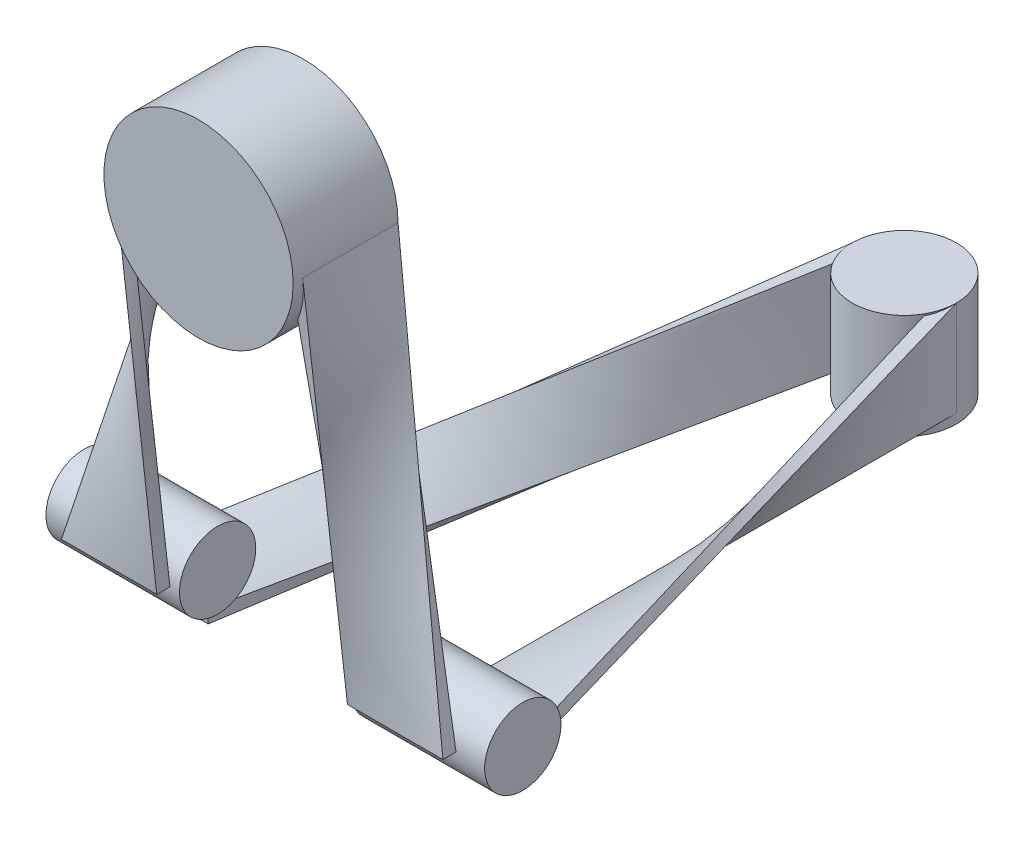
ISO-10303-21;
HEADER;
FILE_DESCRIPTION(('STEP AP214'),'2;1');
FILE_NAME('part.step','',(''),(''),'','','');
FILE_SCHEMA(('AUTOMOTIVE_DESIGN { 1 0 10303 214 1 1 1 1 }'));
ENDSEC;
DATA;
#1=APPLICATION_CONTEXT('core data for automotive mechanical design processes');
#2=APPLICATION_PROTOCOL_DEFINITION('international standard','automotive_design',2000,#1);
#3=PRODUCT_CONTEXT('',#1,'mechanical');
#4=PRODUCT('Part','Part','',(#3));
#5=PRODUCT_RELATED_PRODUCT_CATEGORY('part','',(#4));
#6=PRODUCT_DEFINITION_FORMATION('','',#4);
#7=PRODUCT_DEFINITION_CONTEXT('part definition',#1,'design');
#8=PRODUCT_DEFINITION('design','',#6,#7);
#9=PRODUCT_DEFINITION_SHAPE('','',#8);
#10=(LENGTH_UNIT() NAMED_UNIT(*) SI_UNIT(.MILLI.,.METRE.));
#11=(NAMED_UNIT(*) PLANE_ANGLE_UNIT() SI_UNIT($,.RADIAN.));
#12=(NAMED_UNIT(*) SI_UNIT($,.STERADIAN.) SOLID_ANGLE_UNIT());
#13=UNCERTAINTY_MEASURE_WITH_UNIT(LENGTH_MEASURE(1.E-05),#10,'distance_accuracy_value','');
#14=(GEOMETRIC_REPRESENTATION_CONTEXT(3) GLOBAL_UNCERTAINTY_ASSIGNED_CONTEXT((#13)) GLOBAL_UNIT_ASSIGNED_CONTEXT((#10,
#11,#12)) REPRESENTATION_CONTEXT('',''));
#15=CARTESIAN_POINT('',(0.,0.,0.));
#16=DIRECTION('',(0.,0.,1.));
#17=DIRECTION('',(1.,0.,0.));
#18=AXIS2_PLACEMENT_3D('',#15,#16,#17);
#19=CARTESIAN_POINT('',(0.,-41.,0.));
#20=DIRECTION('',(0.,-1.,0.));
#21=DIRECTION('',(0.,0.,-1.));
#22=AXIS2_PLACEMENT_3D('',#19,#20,#21);
#23=PLANE('',#22);
#24=DIRECTION('',(0.,0.,-1.));
#25=VECTOR('',#24,1.);
#26=CARTESIAN_POINT('',(-20.,-41.,5.38));
#27=LINE('',#26,#25);
#28=CARTESIAN_POINT('',(-20.,-41.,5.38));
#29=VERTEX_POINT('',#28);
#30=CARTESIAN_POINT('',(-20.,-41.,4.));
#31=VERTEX_POINT('',#30);
#32=EDGE_CURVE('E256',#29,#31,#27,.T.);
#33=ORIENTED_EDGE('',*,*,#32,.T.);
#34=DIRECTION('',(-1.,0.,0.));
#35=VECTOR('',#34,1.);
#36=CARTESIAN_POINT('',(-9.99999999999999,-41.,4.));
#37=LINE('',#36,#35);
#38=CARTESIAN_POINT('',(-9.99999999999999,-41.,4.));
#39=VERTEX_POINT('',#38);
#40=EDGE_CURVE('E247',#39,#31,#37,.T.);
#41=ORIENTED_EDGE('',*,*,#40,.F.);
#42=DIRECTION('',(0.,0.,1.));
#43=VECTOR('',#42,1.);
#44=CARTESIAN_POINT('',(-9.99999999999999,-41.,4.));
#45=LINE('',#44,#43);
#46=CARTESIAN_POINT('',(-9.99999999999999,-41.,5.38));
#47=VERTEX_POINT('',#46);
#48=EDGE_CURVE('E74',#39,#47,#45,.T.);
#49=ORIENTED_EDGE('',*,*,#48,.T.);
#50=DIRECTION('',(-1.,0.,0.));
#51=VECTOR('',#50,1.);
#52=CARTESIAN_POINT('',(-9.99999999999999,-41.,5.38));
#53=LINE('',#52,#51);
#54=EDGE_CURVE('E13',#47,#29,#53,.T.);
#55=ORIENTED_EDGE('',*,*,#54,.T.);
#56=EDGE_LOOP('',(#33,#41,#49,#55));
#57=FACE_BOUND('',#56,.T.);
#58=ADVANCED_FACE('F64',(#57),#23,.T.);
#59=CARTESIAN_POINT('',(0.,0.,0.));
#60=DIRECTION('',(0.,1.,0.));
#61=DIRECTION('',(0.,0.,1.));
#62=AXIS2_PLACEMENT_3D('',#59,#60,#61);
#63=PLANE('',#62);
#64=DIRECTION('',(-1.,0.,0.));
#65=VECTOR('',#64,1.);
#66=CARTESIAN_POINT('',(-8.539796,0.,0.));
#67=LINE('',#66,#65);
#68=CARTESIAN_POINT('',(-8.539796,0.,0.));
#69=VERTEX_POINT('',#68);
#70=CARTESIAN_POINT('',(-9.919796,0.,0.));
#71=VERTEX_POINT('',#70);
#72=EDGE_CURVE('E133',#69,#71,#67,.T.);
#73=ORIENTED_EDGE('',*,*,#72,.T.);
#74=DIRECTION('',(0.,0.,-1.));
#75=VECTOR('',#74,1.);
#76=CARTESIAN_POINT('',(-9.919796,0.,10.));
#77=LINE('',#76,#75);
#78=CARTESIAN_POINT('',(-9.919796,0.,10.));
#79=VERTEX_POINT('',#78);
#80=EDGE_CURVE('E113',#79,#71,#77,.T.);
#81=ORIENTED_EDGE('',*,*,#80,.F.);
#82=DIRECTION('',(1.,0.,0.));
#83=VECTOR('',#82,1.);
#84=CARTESIAN_POINT('',(-9.919796,0.,10.));
#85=LINE('',#84,#83);
#86=CARTESIAN_POINT('',(-8.539796,0.,10.));
#87=VERTEX_POINT('',#86);
#88=EDGE_CURVE('E122',#79,#87,#85,.T.);
#89=ORIENTED_EDGE('',*,*,#88,.T.);
#90=DIRECTION('',(0.,0.,-1.));
#91=VECTOR('',#90,1.);
#92=CARTESIAN_POINT('',(-8.539796,0.,10.));
#93=LINE('',#92,#91);
#94=EDGE_CURVE('E119',#87,#69,#93,.T.);
#95=ORIENTED_EDGE('',*,*,#94,.T.);
#96=EDGE_LOOP('',(#73,#81,#89,#95));
#97=FACE_BOUND('',#96,.T.);
#98=ADVANCED_FACE('F132',(#97),#63,.T.);
#99=CARTESIAN_POINT('',(-9.919796,0.,10.));
#100=CARTESIAN_POINT('',(-9.99999999999999,-41.,5.38));
#101=CARTESIAN_POINT('',(-9.689796,0.,10.));
#102=CARTESIAN_POINT('',(-9.99999999999999,-41.,5.15));
#103=CARTESIAN_POINT('',(-9.459796,0.,10.));
#104=CARTESIAN_POINT('',(-9.99999999999999,-41.,4.92));
#105=CARTESIAN_POINT('',(-8.999796,0.,10.));
#106=CARTESIAN_POINT('',(-9.99999999999999,-41.,4.46));
#107=CARTESIAN_POINT('',(-8.769796,0.,10.));
#108=CARTESIAN_POINT('',(-9.99999999999999,-41.,4.23));
#109=CARTESIAN_POINT('',(-8.539796,0.,10.));
#110=CARTESIAN_POINT('',(-9.99999999999999,-41.,4.));
#111=B_SPLINE_SURFACE_WITH_KNOTS('',3,1,((#99,#100),(#101,#102),(#103,#104),(#105,#106),(#107,
#108),(#109,#110)),.UNSPECIFIED.,.F.,.F.,.F.,(4,2,4),(2,2),(0.,0.5,1.),(0.,1.),.UNSPECIFIED.);
#112=DIRECTION('',(0.00194388914486237,0.993709228210088,0.111974064251966));
#113=VECTOR('',#112,1.);
#114=CARTESIAN_POINT('',(-9.959898,-20.5,7.69));
#115=LINE('',#114,#113);
#116=EDGE_CURVE('E109',#47,#79,#115,.T.);
#117=DIRECTION('',(-0.0352175302961988,-0.988847272123728,-0.144709356896155));
#118=VECTOR('',#117,1.);
#119=CARTESIAN_POINT('',(-9.269898,-20.5,7.));
#120=LINE('',#119,#118);
#121=EDGE_CURVE('E89',#87,#39,#120,.T.);
#122=ORIENTED_EDGE('',*,*,#88,.F.);
#123=ORIENTED_EDGE('',*,*,#116,.F.);
#124=ORIENTED_EDGE('',*,*,#48,.F.);
#125=ORIENTED_EDGE('',*,*,#121,.F.);
#126=EDGE_LOOP('',(#122,#123,#124,#125));
#127=FACE_BOUND('',#126,.T.);
#128=ADVANCED_FACE('F124',(#127),#111,.F.);
#129=CARTESIAN_POINT('',(-8.539796,0.,10.));
#130=CARTESIAN_POINT('',(-9.99999999999999,-41.,4.));
#131=CARTESIAN_POINT('',(-8.539796,0.,8.33333333333334));
#132=CARTESIAN_POINT('',(-11.6666666666667,-41.,4.));
#133=CARTESIAN_POINT('',(-8.539796,0.,6.66666666666667));
#134=CARTESIAN_POINT('',(-13.3333333333333,-41.,4.));
#135=CARTESIAN_POINT('',(-8.539796,0.,3.33333333333334));
#136=CARTESIAN_POINT('',(-16.6666666666667,-41.,4.));
#137=CARTESIAN_POINT('',(-8.539796,0.,1.66666666666667));
#138=CARTESIAN_POINT('',(-18.3333333333333,-41.,4.));
#139=CARTESIAN_POINT('',(-8.539796,0.,0.));
#140=CARTESIAN_POINT('',(-20.,-41.,4.));
#141=B_SPLINE_SURFACE_WITH_KNOTS('',3,1,((#129,#130),(#131,#132),(#133,#134),(#135,#136),(#137,
#138),(#139,#140)),.UNSPECIFIED.,.F.,.F.,.F.,(4,2,4),(2,2),(0.,0.5,1.),(0.,1.),.UNSPECIFIED.);
#142=DIRECTION('',(-0.26801821496093,-0.958861361752211,0.0935474499270449));
#143=VECTOR('',#142,1.);
#144=CARTESIAN_POINT('',(-14.269898,-20.5,2.));
#145=LINE('',#144,#143);
#146=EDGE_CURVE('E82',#69,#31,#145,.T.);
#147=ORIENTED_EDGE('',*,*,#94,.F.);
#148=ORIENTED_EDGE('',*,*,#121,.T.);
#149=ORIENTED_EDGE('',*,*,#40,.T.);
#150=ORIENTED_EDGE('',*,*,#146,.F.);
#151=EDGE_LOOP('',(#147,#148,#149,#150));
#152=FACE_BOUND('',#151,.T.);
#153=ADVANCED_FACE('F214',(#152),#141,.F.);
#154=CARTESIAN_POINT('',(-9.919796,0.,0.));
#155=CARTESIAN_POINT('',(-20.,-41.,5.38));
#156=CARTESIAN_POINT('',(-9.919796,0.,1.66666666666666));
#157=CARTESIAN_POINT('',(-18.3333333333333,-41.,5.38));
#158=CARTESIAN_POINT('',(-9.919796,0.,3.33333333333333));
#159=CARTESIAN_POINT('',(-16.6666666666667,-41.,5.38));
#160=CARTESIAN_POINT('',(-9.919796,0.,6.66666666666666));
#161=CARTESIAN_POINT('',(-13.3333333333333,-41.,5.38));
#162=CARTESIAN_POINT('',(-9.919796,0.,8.33333333333333));
#163=CARTESIAN_POINT('',(-11.6666666666667,-41.,5.38));
#164=CARTESIAN_POINT('',(-9.919796,0.,10.));
#165=CARTESIAN_POINT('',(-9.99999999999999,-41.,5.38));
#166=B_SPLINE_SURFACE_WITH_KNOTS('',3,1,((#154,#155),(#156,#157),(#158,#159),(#160,#161),(#162,
#163),(#164,#165)),.UNSPECIFIED.,.F.,.F.,.F.,(4,2,4),(2,2),(0.,0.5,1.),(0.,1.),.UNSPECIFIED.);
#167=DIRECTION('',(-0.236833738086735,-0.963292336301542,0.126402750470788));
#168=VECTOR('',#167,1.);
#169=CARTESIAN_POINT('',(-14.959898,-20.5,2.69));
#170=LINE('',#169,#168);
#171=EDGE_CURVE('E185',#71,#29,#170,.T.);
#172=ORIENTED_EDGE('',*,*,#80,.T.);
#173=ORIENTED_EDGE('',*,*,#171,.T.);
#174=ORIENTED_EDGE('',*,*,#54,.F.);
#175=ORIENTED_EDGE('',*,*,#116,.T.);
#176=EDGE_LOOP('',(#172,#173,#174,#175));
#177=FACE_BOUND('',#176,.T.);
#178=ADVANCED_FACE('F111',(#177),#166,.F.);
#179=CARTESIAN_POINT('',(-8.539796,0.,0.));
#180=CARTESIAN_POINT('',(-20.,-41.,4.));
#181=CARTESIAN_POINT('',(-8.76979600000001,0.,0.));
#182=CARTESIAN_POINT('',(-20.,-41.,4.23));
#183=CARTESIAN_POINT('',(-8.99979600000001,0.,0.));
#184=CARTESIAN_POINT('',(-20.,-41.,4.46));
#185=CARTESIAN_POINT('',(-9.45979600000001,0.,0.));
#186=CARTESIAN_POINT('',(-20.,-41.,4.92));
#187=CARTESIAN_POINT('',(-9.68979600000001,0.,0.));
#188=CARTESIAN_POINT('',(-20.,-41.,5.15));
#189=CARTESIAN_POINT('',(-9.919796,0.,0.));
#190=CARTESIAN_POINT('',(-20.,-41.,5.38));
#191=B_SPLINE_SURFACE_WITH_KNOTS('',3,1,((#179,#180),(#181,#182),(#183,#184),(#185,#186),(#187,
#188),(#189,#190)),.UNSPECIFIED.,.F.,.F.,.F.,(4,2,4),(2,2),(0.,0.5,1.),(0.,1.),.UNSPECIFIED.);
#192=ORIENTED_EDGE('',*,*,#72,.F.);
#193=ORIENTED_EDGE('',*,*,#146,.T.);
#194=ORIENTED_EDGE('',*,*,#32,.F.);
#195=ORIENTED_EDGE('',*,*,#171,.F.);
#196=EDGE_LOOP('',(#192,#193,#194,#195));
#197=FACE_BOUND('',#196,.T.);
#198=ADVANCED_FACE('F184',(#197),#191,.F.);
#199=CLOSED_SHELL('',(#58,#98,#128,#153,#178,#198));
#200=MANIFOLD_SOLID_BREP('B2',#199);
#201=CARTESIAN_POINT('',(0.,0.,-63.));
#202=DIRECTION('',(0.,0.,1.));
#203=DIRECTION('',(-1.,0.,0.));
#204=AXIS2_PLACEMENT_3D('',#201,#202,#203);
#205=PLANE('',#204);
#206=DIRECTION('',(1.,0.,0.));
#207=VECTOR('',#206,1.);
#208=CARTESIAN_POINT('',(-5.46345799999999,-41.,-63.));
#209=LINE('',#208,#207);
#210=CARTESIAN_POINT('',(-5.46345799999999,-41.,-63.));
#211=VERTEX_POINT('',#210);
#212=CARTESIAN_POINT('',(-4.08345799999999,-41.,-63.));
#213=VERTEX_POINT('',#212);
#214=EDGE_CURVE('E459',#211,#213,#209,.T.);
#215=ORIENTED_EDGE('',*,*,#214,.T.);
#216=DIRECTION('',(0.,-1.,0.));
#217=VECTOR('',#216,1.);
#218=CARTESIAN_POINT('',(-4.08345799999999,-41.,-63.));
#219=LINE('',#218,#217);
#220=CARTESIAN_POINT('',(-4.08345799999999,-51.,-63.));
#221=VERTEX_POINT('',#220);
#222=EDGE_CURVE('E616',#213,#221,#219,.T.);
#223=ORIENTED_EDGE('',*,*,#222,.T.);
#224=DIRECTION('',(-1.,0.,0.));
#225=VECTOR('',#224,1.);
#226=CARTESIAN_POINT('',(-4.08345799999999,-51.,-63.));
#227=LINE('',#226,#225);
#228=CARTESIAN_POINT('',(-5.46345799999999,-51.,-63.));
#229=VERTEX_POINT('',#228);
#230=EDGE_CURVE('E420',#221,#229,#227,.T.);
#231=ORIENTED_EDGE('',*,*,#230,.T.);
#232=DIRECTION('',(0.,1.,0.));
#233=VECTOR('',#232,1.);
#234=CARTESIAN_POINT('',(-5.46345799999999,-51.,-63.));
#235=LINE('',#234,#233);
#236=EDGE_CURVE('E62',#229,#211,#235,.T.);
#237=ORIENTED_EDGE('',*,*,#236,.T.);
#238=EDGE_LOOP('',(#215,#223,#231,#237));
#239=FACE_BOUND('',#238,.T.);
#240=ADVANCED_FACE('F410',(#239),#205,.F.);
#241=CARTESIAN_POINT('',(0.,0.,0.));
#242=DIRECTION('',(0.,0.,-1.));
#243=DIRECTION('',(1.,0.,0.));
#244=AXIS2_PLACEMENT_3D('',#241,#242,#243);
#245=PLANE('',#244);
#246=DIRECTION('',(0.,-1.,0.));
#247=VECTOR('',#246,1.);
#248=CARTESIAN_POINT('',(-20.,-45.,0.));
#249=LINE('',#248,#247);
#250=CARTESIAN_POINT('',(-20.,-45.,0.));
#251=VERTEX_POINT('',#250);
#252=CARTESIAN_POINT('',(-20.,-46.38,0.));
#253=VERTEX_POINT('',#252);
#254=EDGE_CURVE('E456',#251,#253,#249,.T.);
#255=ORIENTED_EDGE('',*,*,#254,.T.);
#256=DIRECTION('',(1.,0.,0.));
#257=VECTOR('',#256,1.);
#258=CARTESIAN_POINT('',(-20.,-46.38,0.));
#259=LINE('',#258,#257);
#260=CARTESIAN_POINT('',(-10.,-46.38,0.));
#261=VERTEX_POINT('',#260);
#262=EDGE_CURVE('E464',#253,#261,#259,.T.);
#263=ORIENTED_EDGE('',*,*,#262,.T.);
#264=DIRECTION('',(0.,1.,0.));
#265=VECTOR('',#264,1.);
#266=CARTESIAN_POINT('',(-10.,-46.38,0.));
#267=LINE('',#266,#265);
#268=CARTESIAN_POINT('',(-10.,-45.,0.));
#269=VERTEX_POINT('',#268);
#270=EDGE_CURVE('E470',#261,#269,#267,.T.);
#271=ORIENTED_EDGE('',*,*,#270,.T.);
#272=DIRECTION('',(-1.,0.,0.));
#273=VECTOR('',#272,1.);
#274=CARTESIAN_POINT('',(-10.,-45.,0.));
#275=LINE('',#274,#273);
#276=EDGE_CURVE('E461',#269,#251,#275,.T.);
#277=ORIENTED_EDGE('',*,*,#276,.T.);
#278=EDGE_LOOP('',(#255,#263,#271,#277));
#279=FACE_BOUND('',#278,.T.);
#280=ADVANCED_FACE('F476',(#279),#245,.F.);
#281=CARTESIAN_POINT('',(-20.,-46.38,0.));
#282=CARTESIAN_POINT('',(-5.46345799999999,-41.,-63.));
#283=CARTESIAN_POINT('',(-18.3333333333333,-46.38,0.));
#284=CARTESIAN_POINT('',(-5.46345799999999,-42.6666666666666,-63.));
#285=CARTESIAN_POINT('',(-16.6666666666666,-46.38,0.));
#286=CARTESIAN_POINT('',(-5.46345799999999,-44.3333333333333,-63.));
#287=CARTESIAN_POINT('',(-13.3333333333333,-46.38,0.));
#288=CARTESIAN_POINT('',(-5.46345799999999,-47.6666666666666,-63.));
#289=CARTESIAN_POINT('',(-11.6666666666667,-46.38,0.));
#290=CARTESIAN_POINT('',(-5.46345799999999,-49.3333333333333,-63.));
#291=CARTESIAN_POINT('',(-10.,-46.38,0.));
#292=CARTESIAN_POINT('',(-5.46345799999999,-51.,-63.));
#293=B_SPLINE_SURFACE_WITH_KNOTS('',3,1,((#281,#282),(#283,#284),(#285,#286),(#287,#288),(#289,
#290),(#291,#292)),.UNSPECIFIED.,.F.,.F.,.F.,(4,2,4),(2,2),(0.,0.5,1.),(0.,1.),.UNSPECIFIED.);
#294=DIRECTION('',(-0.224056973740671,-0.0829238837355409,0.971041761215442));
#295=VECTOR('',#294,1.);
#296=CARTESIAN_POINT('',(-12.731729,-43.69,-31.5));
#297=LINE('',#296,#295);
#298=EDGE_CURVE('E428',#211,#253,#297,.T.);
#299=DIRECTION('',(0.0716312758043137,-0.0729490643348894,-0.994759968203039));
#300=VECTOR('',#299,1.);
#301=CARTESIAN_POINT('',(-7.731729,-48.69,-31.5));
#302=LINE('',#301,#300);
#303=EDGE_CURVE('E435',#261,#229,#302,.T.);
#304=ORIENTED_EDGE('',*,*,#262,.F.);
#305=ORIENTED_EDGE('',*,*,#298,.F.);
#306=ORIENTED_EDGE('',*,*,#236,.F.);
#307=ORIENTED_EDGE('',*,*,#303,.F.);
#308=EDGE_LOOP('',(#304,#305,#306,#307));
#309=FACE_BOUND('',#308,.T.);
#310=ADVANCED_FACE('F466',(#309),#293,.F.);
#311=CARTESIAN_POINT('',(-10.,-46.38,0.));
#312=CARTESIAN_POINT('',(-5.46345799999999,-51.,-63.));
#313=CARTESIAN_POINT('',(-10.,-46.15,0.));
#314=CARTESIAN_POINT('',(-5.23345799999997,-51.,-63.));
#315=CARTESIAN_POINT('',(-10.,-45.92,0.));
#316=CARTESIAN_POINT('',(-5.00345799999996,-51.,-63.));
#317=CARTESIAN_POINT('',(-10.,-45.46,0.));
#318=CARTESIAN_POINT('',(-4.54345799999996,-51.,-63.));
#319=CARTESIAN_POINT('',(-10.,-45.23,0.));
#320=CARTESIAN_POINT('',(-4.31345799999997,-51.,-63.));
#321=CARTESIAN_POINT('',(-10.,-45.,0.));
#322=CARTESIAN_POINT('',(-4.08345799999999,-51.,-63.));
#323=B_SPLINE_SURFACE_WITH_KNOTS('',3,1,((#311,#312),(#313,#314),(#315,#316),(#317,#318),(#319,
#320),(#321,#322)),.UNSPECIFIED.,.F.,.F.,.F.,(4,2,4),(2,2),(0.,0.5,1.),(0.,1.),.UNSPECIFIED.);
#324=DIRECTION('',(0.0930844153353303,-0.0943974524328535,-0.991173250544962));
#325=VECTOR('',#324,1.);
#326=CARTESIAN_POINT('',(-7.041729,-48.,-31.5));
#327=LINE('',#326,#325);
#328=EDGE_CURVE('E569',#269,#221,#327,.T.);
#329=ORIENTED_EDGE('',*,*,#270,.F.);
#330=ORIENTED_EDGE('',*,*,#303,.T.);
#331=ORIENTED_EDGE('',*,*,#230,.F.);
#332=ORIENTED_EDGE('',*,*,#328,.F.);
#333=EDGE_LOOP('',(#329,#330,#331,#332));
#334=FACE_BOUND('',#333,.T.);
#335=ADVANCED_FACE('F542',(#334),#323,.F.);
#336=CARTESIAN_POINT('',(-20.,-45.,0.));
#337=CARTESIAN_POINT('',(-4.08345799999999,-41.,-63.));
#338=CARTESIAN_POINT('',(-20.,-45.23,0.));
#339=CARTESIAN_POINT('',(-4.31345799999999,-41.,-63.));
#340=CARTESIAN_POINT('',(-20.,-45.4599999999999,0.));
#341=CARTESIAN_POINT('',(-4.54345799999999,-41.,-63.));
#342=CARTESIAN_POINT('',(-20.,-45.9199999999999,0.));
#343=CARTESIAN_POINT('',(-5.00345799999999,-41.,-63.));
#344=CARTESIAN_POINT('',(-20.,-46.15,0.));
#345=CARTESIAN_POINT('',(-5.23345799999999,-41.,-63.));
#346=CARTESIAN_POINT('',(-20.,-46.38,0.));
#347=CARTESIAN_POINT('',(-5.46345799999999,-41.,-63.));
#348=B_SPLINE_SURFACE_WITH_KNOTS('',3,1,((#336,#337),(#338,#339),(#340,#341),(#342,#343),(#344,
#345),(#346,#347)),.UNSPECIFIED.,.F.,.F.,.F.,(4,2,4),(2,2),(0.,0.5,1.),(0.,1.),.UNSPECIFIED.);
#349=DIRECTION('',(0.244484320759416,0.0614415670839597,-0.967704681572366));
#350=VECTOR('',#349,1.);
#351=CARTESIAN_POINT('',(-12.041729,-43.,-31.5));
#352=LINE('',#351,#350);
#353=EDGE_CURVE('E567',#251,#213,#352,.T.);
#354=ORIENTED_EDGE('',*,*,#254,.F.);
#355=ORIENTED_EDGE('',*,*,#353,.T.);
#356=ORIENTED_EDGE('',*,*,#214,.F.);
#357=ORIENTED_EDGE('',*,*,#298,.T.);
#358=EDGE_LOOP('',(#354,#355,#356,#357));
#359=FACE_BOUND('',#358,.T.);
#360=ADVANCED_FACE('F454',(#359),#348,.F.);
#361=CARTESIAN_POINT('',(-10.,-45.,0.));
#362=CARTESIAN_POINT('',(-4.08345799999999,-51.,-63.));
#363=CARTESIAN_POINT('',(-11.6666666666667,-45.,0.));
#364=CARTESIAN_POINT('',(-4.08345799999999,-49.3333333333333,-63.));
#365=CARTESIAN_POINT('',(-13.3333333333333,-45.,0.));
#366=CARTESIAN_POINT('',(-4.08345799999999,-47.6666666666667,-63.));
#367=CARTESIAN_POINT('',(-16.6666666666667,-45.,0.));
#368=CARTESIAN_POINT('',(-4.08345799999999,-44.3333333333334,-63.));
#369=CARTESIAN_POINT('',(-18.3333333333333,-45.,0.));
#370=CARTESIAN_POINT('',(-4.08345799999999,-42.6666666666667,-63.));
#371=CARTESIAN_POINT('',(-20.,-45.,0.));
#372=CARTESIAN_POINT('',(-4.08345799999999,-41.,-63.));
#373=B_SPLINE_SURFACE_WITH_KNOTS('',3,1,((#361,#362),(#363,#364),(#365,#366),(#367,#368),(#369,
#370),(#371,#372)),.UNSPECIFIED.,.F.,.F.,.F.,(4,2,4),(2,2),(0.,0.5,1.),(0.,1.),.UNSPECIFIED.);
#374=ORIENTED_EDGE('',*,*,#276,.F.);
#375=ORIENTED_EDGE('',*,*,#328,.T.);
#376=ORIENTED_EDGE('',*,*,#222,.F.);
#377=ORIENTED_EDGE('',*,*,#353,.F.);
#378=EDGE_LOOP('',(#374,#375,#376,#377));
#379=FACE_BOUND('',#378,.T.);
#380=ADVANCED_FACE('F541',(#379),#373,.F.);
#381=CLOSED_SHELL('',(#240,#280,#310,#335,#360,#380));
#382=MANIFOLD_SOLID_BREP('B7',#381);
#383=CARTESIAN_POINT('',(0.,0.,-63.));
#384=DIRECTION('',(0.,0.,1.));
#385=DIRECTION('',(1.,0.,0.));
#386=AXIS2_PLACEMENT_3D('',#383,#384,#385);
#387=PLANE('',#386);
#388=DIRECTION('',(-1.,0.,0.));
#389=VECTOR('',#388,1.);
#390=CARTESIAN_POINT('',(5.46345799999999,-41.,-63.));
#391=LINE('',#390,#389);
#392=CARTESIAN_POINT('',(5.46345799999999,-41.,-63.));
#393=VERTEX_POINT('',#392);
#394=CARTESIAN_POINT('',(4.08345799999999,-41.,-63.));
#395=VERTEX_POINT('',#394);
#396=EDGE_CURVE('E926',#393,#395,#391,.T.);
#397=ORIENTED_EDGE('',*,*,#396,.F.);
#398=DIRECTION('',(0.,1.,0.));
#399=VECTOR('',#398,1.);
#400=CARTESIAN_POINT('',(5.46345799999999,-51.,-63.));
#401=LINE('',#400,#399);
#402=CARTESIAN_POINT('',(5.46345799999999,-51.,-63.));
#403=VERTEX_POINT('',#402);
#404=EDGE_CURVE('E408',#403,#393,#401,.T.);
#405=ORIENTED_EDGE('',*,*,#404,.F.);
#406=DIRECTION('',(1.,0.,0.));
#407=VECTOR('',#406,1.);
#408=CARTESIAN_POINT('',(4.08345799999999,-51.,-63.));
#409=LINE('',#408,#407);
#410=CARTESIAN_POINT('',(4.08345799999999,-51.,-63.));
#411=VERTEX_POINT('',#410);
#412=EDGE_CURVE('E766',#411,#403,#409,.T.);
#413=ORIENTED_EDGE('',*,*,#412,.F.);
#414=DIRECTION('',(0.,-1.,0.));
#415=VECTOR('',#414,1.);
#416=CARTESIAN_POINT('',(4.08345799999999,-41.,-63.));
#417=LINE('',#416,#415);
#418=EDGE_CURVE('E889',#395,#411,#417,.T.);
#419=ORIENTED_EDGE('',*,*,#418,.F.);
#420=EDGE_LOOP('',(#397,#405,#413,#419));
#421=FACE_BOUND('',#420,.T.);
#422=ADVANCED_FACE('F756',(#421),#387,.F.);
#423=CARTESIAN_POINT('',(0.,0.,0.));
#424=DIRECTION('',(0.,0.,-1.));
#425=DIRECTION('',(-1.,0.,0.));
#426=AXIS2_PLACEMENT_3D('',#423,#424,#425);
#427=PLANE('',#426);
#428=DIRECTION('',(0.,-1.,0.));
#429=VECTOR('',#428,1.);
#430=CARTESIAN_POINT('',(20.,-45.,0.));
#431=LINE('',#430,#429);
#432=CARTESIAN_POINT('',(20.,-45.,0.));
#433=VERTEX_POINT('',#432);
#434=CARTESIAN_POINT('',(20.,-46.38,0.));
#435=VERTEX_POINT('',#434);
#436=EDGE_CURVE('E804',#433,#435,#431,.T.);
#437=ORIENTED_EDGE('',*,*,#436,.F.);
#438=DIRECTION('',(1.,0.,0.));
#439=VECTOR('',#438,1.);
#440=CARTESIAN_POINT('',(10.,-45.,0.));
#441=LINE('',#440,#439);
#442=CARTESIAN_POINT('',(10.,-45.,0.));
#443=VERTEX_POINT('',#442);
#444=EDGE_CURVE('E827',#443,#433,#441,.T.);
#445=ORIENTED_EDGE('',*,*,#444,.F.);
#446=DIRECTION('',(0.,1.,0.));
#447=VECTOR('',#446,1.);
#448=CARTESIAN_POINT('',(10.,-46.38,0.));
#449=LINE('',#448,#447);
#450=CARTESIAN_POINT('',(10.,-46.38,0.));
#451=VERTEX_POINT('',#450);
#452=EDGE_CURVE('E807',#451,#443,#449,.T.);
#453=ORIENTED_EDGE('',*,*,#452,.F.);
#454=DIRECTION('',(-1.,0.,0.));
#455=VECTOR('',#454,1.);
#456=CARTESIAN_POINT('',(20.,-46.38,0.));
#457=LINE('',#456,#455);
#458=EDGE_CURVE('E801',#435,#451,#457,.T.);
#459=ORIENTED_EDGE('',*,*,#458,.F.);
#460=EDGE_LOOP('',(#437,#445,#453,#459));
#461=FACE_BOUND('',#460,.T.);
#462=ADVANCED_FACE('F803',(#461),#427,.F.);
#463=CARTESIAN_POINT('',(20.,-46.38,0.));
#464=CARTESIAN_POINT('',(5.46345799999999,-41.,-63.));
#465=CARTESIAN_POINT('',(18.3333333333333,-46.38,0.));
#466=CARTESIAN_POINT('',(5.46345799999999,-42.6666666666666,-63.));
#467=CARTESIAN_POINT('',(16.6666666666666,-46.38,0.));
#468=CARTESIAN_POINT('',(5.46345799999999,-44.3333333333333,-63.));
#469=CARTESIAN_POINT('',(13.3333333333333,-46.38,0.));
#470=CARTESIAN_POINT('',(5.46345799999999,-47.6666666666666,-63.));
#471=CARTESIAN_POINT('',(11.6666666666667,-46.38,0.));
#472=CARTESIAN_POINT('',(5.46345799999999,-49.3333333333333,-63.));
#473=CARTESIAN_POINT('',(10.,-46.38,0.));
#474=CARTESIAN_POINT('',(5.46345799999999,-51.,-63.));
#475=B_SPLINE_SURFACE_WITH_KNOTS('',3,1,((#463,#464),(#465,#466),(#467,#468),(#469,#470),(#471,
#472),(#473,#474)),.UNSPECIFIED.,.F.,.F.,.F.,(4,2,4),(2,2),(0.,0.5,1.),(0.,1.),.UNSPECIFIED.);
#476=DIRECTION('',(-0.0716312758043137,-0.0729490643348894,-0.994759968203039));
#477=VECTOR('',#476,1.);
#478=CARTESIAN_POINT('',(7.731729,-48.69,-31.5));
#479=LINE('',#478,#477);
#480=EDGE_CURVE('E826',#451,#403,#479,.T.);
#481=DIRECTION('',(0.224056973740671,-0.0829238837355409,0.971041761215442));
#482=VECTOR('',#481,1.);
#483=CARTESIAN_POINT('',(12.731729,-43.69,-31.5));
#484=LINE('',#483,#482);
#485=EDGE_CURVE('E774',#393,#435,#484,.T.);
#486=ORIENTED_EDGE('',*,*,#458,.T.);
#487=ORIENTED_EDGE('',*,*,#480,.T.);
#488=ORIENTED_EDGE('',*,*,#404,.T.);
#489=ORIENTED_EDGE('',*,*,#485,.T.);
#490=EDGE_LOOP('',(#486,#487,#488,#489));
#491=FACE_BOUND('',#490,.T.);
#492=ADVANCED_FACE('F824',(#491),#475,.T.);
#493=CARTESIAN_POINT('',(10.,-46.38,0.));
#494=CARTESIAN_POINT('',(5.46345799999999,-51.,-63.));
#495=CARTESIAN_POINT('',(10.,-46.15,0.));
#496=CARTESIAN_POINT('',(5.23345799999997,-51.,-63.));
#497=CARTESIAN_POINT('',(10.,-45.92,0.));
#498=CARTESIAN_POINT('',(5.00345799999996,-51.,-63.));
#499=CARTESIAN_POINT('',(10.,-45.46,0.));
#500=CARTESIAN_POINT('',(4.54345799999996,-51.,-63.));
#501=CARTESIAN_POINT('',(10.,-45.23,0.));
#502=CARTESIAN_POINT('',(4.31345799999997,-51.,-63.));
#503=CARTESIAN_POINT('',(10.,-45.,0.));
#504=CARTESIAN_POINT('',(4.08345799999999,-51.,-63.));
#505=B_SPLINE_SURFACE_WITH_KNOTS('',3,1,((#493,#494),(#495,#496),(#497,#498),(#499,#500),(#501,
#502),(#503,#504)),.UNSPECIFIED.,.F.,.F.,.F.,(4,2,4),(2,2),(0.,0.5,1.),(0.,1.),.UNSPECIFIED.);
#506=DIRECTION('',(-0.0930844153353303,-0.0943974524328535,-0.991173250544962));
#507=VECTOR('',#506,1.);
#508=CARTESIAN_POINT('',(7.041729,-48.,-31.5));
#509=LINE('',#508,#507);
#510=EDGE_CURVE('E829',#443,#411,#509,.T.);
#511=ORIENTED_EDGE('',*,*,#452,.T.);
#512=ORIENTED_EDGE('',*,*,#510,.T.);
#513=ORIENTED_EDGE('',*,*,#412,.T.);
#514=ORIENTED_EDGE('',*,*,#480,.F.);
#515=EDGE_LOOP('',(#511,#512,#513,#514));
#516=FACE_BOUND('',#515,.T.);
#517=ADVANCED_FACE('F853',(#516),#505,.T.);
#518=CARTESIAN_POINT('',(20.,-45.,0.));
#519=CARTESIAN_POINT('',(4.08345799999999,-41.,-63.));
#520=CARTESIAN_POINT('',(20.,-45.23,0.));
#521=CARTESIAN_POINT('',(4.31345799999999,-41.,-63.));
#522=CARTESIAN_POINT('',(20.,-45.4599999999999,0.));
#523=CARTESIAN_POINT('',(4.54345799999999,-41.,-63.));
#524=CARTESIAN_POINT('',(20.,-45.9199999999999,0.));
#525=CARTESIAN_POINT('',(5.00345799999999,-41.,-63.));
#526=CARTESIAN_POINT('',(20.,-46.15,0.));
#527=CARTESIAN_POINT('',(5.23345799999999,-41.,-63.));
#528=CARTESIAN_POINT('',(20.,-46.38,0.));
#529=CARTESIAN_POINT('',(5.46345799999999,-41.,-63.));
#530=B_SPLINE_SURFACE_WITH_KNOTS('',3,1,((#518,#519),(#520,#521),(#522,#523),(#524,#525),(#526,
#527),(#528,#529)),.UNSPECIFIED.,.F.,.F.,.F.,(4,2,4),(2,2),(0.,0.5,1.),(0.,1.),.UNSPECIFIED.);
#531=DIRECTION('',(-0.244484320759416,0.0614415670839597,-0.967704681572366));
#532=VECTOR('',#531,1.);
#533=CARTESIAN_POINT('',(12.041729,-43.,-31.5));
#534=LINE('',#533,#532);
#535=EDGE_CURVE('E819',#433,#395,#534,.T.);
#536=ORIENTED_EDGE('',*,*,#436,.T.);
#537=ORIENTED_EDGE('',*,*,#485,.F.);
#538=ORIENTED_EDGE('',*,*,#396,.T.);
#539=ORIENTED_EDGE('',*,*,#535,.F.);
#540=EDGE_LOOP('',(#536,#537,#538,#539));
#541=FACE_BOUND('',#540,.T.);
#542=ADVANCED_FACE('F817',(#541),#530,.T.);
#543=CARTESIAN_POINT('',(10.,-45.,0.));
#544=CARTESIAN_POINT('',(4.08345799999999,-51.,-63.));
#545=CARTESIAN_POINT('',(11.6666666666667,-45.,0.));
#546=CARTESIAN_POINT('',(4.08345799999999,-49.3333333333333,-63.));
#547=CARTESIAN_POINT('',(13.3333333333333,-45.,0.));
#548=CARTESIAN_POINT('',(4.08345799999999,-47.6666666666667,-63.));
#549=CARTESIAN_POINT('',(16.6666666666667,-45.,0.));
#550=CARTESIAN_POINT('',(4.08345799999999,-44.3333333333334,-63.));
#551=CARTESIAN_POINT('',(18.3333333333333,-45.,0.));
#552=CARTESIAN_POINT('',(4.08345799999999,-42.6666666666667,-63.));
#553=CARTESIAN_POINT('',(20.,-45.,0.));
#554=CARTESIAN_POINT('',(4.08345799999999,-41.,-63.));
#555=B_SPLINE_SURFACE_WITH_KNOTS('',3,1,((#543,#544),(#545,#546),(#547,#548),(#549,#550),(#551,
#552),(#553,#554)),.UNSPECIFIED.,.F.,.F.,.F.,(4,2,4),(2,2),(0.,0.5,1.),(0.,1.),.UNSPECIFIED.);
#556=ORIENTED_EDGE('',*,*,#444,.T.);
#557=ORIENTED_EDGE('',*,*,#535,.T.);
#558=ORIENTED_EDGE('',*,*,#418,.T.);
#559=ORIENTED_EDGE('',*,*,#510,.F.);
#560=EDGE_LOOP('',(#556,#557,#558,#559));
#561=FACE_BOUND('',#560,.T.);
#562=ADVANCED_FACE('F894',(#561),#555,.T.);
#563=CLOSED_SHELL('',(#422,#462,#492,#517,#542,#562));
#564=MANIFOLD_SOLID_BREP('B56',#563);
#565=CARTESIAN_POINT('',(0.,-41.,0.));
#566=DIRECTION('',(0.,-1.,0.));
#567=DIRECTION('',(0.,0.,-1.));
#568=AXIS2_PLACEMENT_3D('',#565,#566,#567);
#569=PLANE('',#568);
#570=DIRECTION('',(0.,0.,-1.));
#571=VECTOR('',#570,1.);
#572=CARTESIAN_POINT('',(20.,-41.,5.38));
#573=LINE('',#572,#571);
#574=CARTESIAN_POINT('',(20.,-41.,5.38));
#575=VERTEX_POINT('',#574);
#576=CARTESIAN_POINT('',(20.,-41.,4.));
#577=VERTEX_POINT('',#576);
#578=EDGE_CURVE('E1234',#575,#577,#573,.T.);
#579=ORIENTED_EDGE('',*,*,#578,.F.);
#580=DIRECTION('',(1.,0.,0.));
#581=VECTOR('',#580,1.);
#582=CARTESIAN_POINT('',(9.99999999999999,-41.,5.38));
#583=LINE('',#582,#581);
#584=CARTESIAN_POINT('',(9.99999999999999,-41.,5.38));
#585=VERTEX_POINT('',#584);
#586=EDGE_CURVE('E754',#585,#575,#583,.T.);
#587=ORIENTED_EDGE('',*,*,#586,.F.);
#588=DIRECTION('',(0.,0.,1.));
#589=VECTOR('',#588,1.);
#590=CARTESIAN_POINT('',(9.99999999999999,-41.,4.));
#591=LINE('',#590,#589);
#592=CARTESIAN_POINT('',(9.99999999999999,-41.,4.));
#593=VERTEX_POINT('',#592);
#594=EDGE_CURVE('E1110',#593,#585,#591,.T.);
#595=ORIENTED_EDGE('',*,*,#594,.F.);
#596=DIRECTION('',(1.,0.,0.));
#597=VECTOR('',#596,1.);
#598=CARTESIAN_POINT('',(9.99999999999999,-41.,4.));
#599=LINE('',#598,#597);
#600=EDGE_CURVE('E1118',#593,#577,#599,.T.);
#601=ORIENTED_EDGE('',*,*,#600,.T.);
#602=EDGE_LOOP('',(#579,#587,#595,#601));
#603=FACE_BOUND('',#602,.T.);
#604=ADVANCED_FACE('F1100',(#603),#569,.T.);
#605=CARTESIAN_POINT('',(0.,0.,0.));
#606=DIRECTION('',(0.,1.,0.));
#607=DIRECTION('',(0.,0.,1.));
#608=AXIS2_PLACEMENT_3D('',#605,#606,#607);
#609=PLANE('',#608);
#610=DIRECTION('',(1.,0.,0.));
#611=VECTOR('',#610,1.);
#612=CARTESIAN_POINT('',(8.539796,0.,0.));
#613=LINE('',#612,#611);
#614=CARTESIAN_POINT('',(8.539796,0.,0.));
#615=VERTEX_POINT('',#614);
#616=CARTESIAN_POINT('',(9.919796,0.,0.));
#617=VERTEX_POINT('',#616);
#618=EDGE_CURVE('E1169',#615,#617,#613,.T.);
#619=ORIENTED_EDGE('',*,*,#618,.F.);
#620=DIRECTION('',(0.,0.,-1.));
#621=VECTOR('',#620,1.);
#622=CARTESIAN_POINT('',(8.539796,0.,10.));
#623=LINE('',#622,#621);
#624=CARTESIAN_POINT('',(8.539796,0.,10.));
#625=VERTEX_POINT('',#624);
#626=EDGE_CURVE('E1152',#625,#615,#623,.T.);
#627=ORIENTED_EDGE('',*,*,#626,.F.);
#628=DIRECTION('',(-1.,0.,0.));
#629=VECTOR('',#628,1.);
#630=CARTESIAN_POINT('',(9.919796,0.,10.));
#631=LINE('',#630,#629);
#632=CARTESIAN_POINT('',(9.919796,0.,10.));
#633=VERTEX_POINT('',#632);
#634=EDGE_CURVE('E1143',#633,#625,#631,.T.);
#635=ORIENTED_EDGE('',*,*,#634,.F.);
#636=DIRECTION('',(0.,0.,-1.));
#637=VECTOR('',#636,1.);
#638=CARTESIAN_POINT('',(9.919796,0.,10.));
#639=LINE('',#638,#637);
#640=EDGE_CURVE('E1148',#633,#617,#639,.T.);
#641=ORIENTED_EDGE('',*,*,#640,.T.);
#642=EDGE_LOOP('',(#619,#627,#635,#641));
#643=FACE_BOUND('',#642,.T.);
#644=ADVANCED_FACE('F1147',(#643),#609,.T.);
#645=CARTESIAN_POINT('',(9.919796,0.,10.));
#646=CARTESIAN_POINT('',(9.99999999999999,-41.,5.38));
#647=CARTESIAN_POINT('',(9.689796,0.,10.));
#648=CARTESIAN_POINT('',(9.99999999999999,-41.,5.15));
#649=CARTESIAN_POINT('',(9.459796,0.,10.));
#650=CARTESIAN_POINT('',(9.99999999999999,-41.,4.92));
#651=CARTESIAN_POINT('',(8.999796,0.,10.));
#652=CARTESIAN_POINT('',(9.99999999999999,-41.,4.46));
#653=CARTESIAN_POINT('',(8.769796,0.,10.));
#654=CARTESIAN_POINT('',(9.99999999999999,-41.,4.23));
#655=CARTESIAN_POINT('',(8.539796,0.,10.));
#656=CARTESIAN_POINT('',(9.99999999999999,-41.,4.));
#657=B_SPLINE_SURFACE_WITH_KNOTS('',3,1,((#645,#646),(#647,#648),(#649,#650),(#651,#652),(#653,
#654),(#655,#656)),.UNSPECIFIED.,.F.,.F.,.F.,(4,2,4),(2,2),(0.,0.5,1.),(0.,1.),.UNSPECIFIED.);
#658=DIRECTION('',(0.0352175302961988,-0.988847272123728,-0.144709356896155));
#659=VECTOR('',#658,1.);
#660=CARTESIAN_POINT('',(9.269898,-20.5,7.));
#661=LINE('',#660,#659);
#662=EDGE_CURVE('E1175',#625,#593,#661,.T.);
#663=DIRECTION('',(-0.00194388914486237,0.993709228210088,0.111974064251966));
#664=VECTOR('',#663,1.);
#665=CARTESIAN_POINT('',(9.959898,-20.5,7.69));
#666=LINE('',#665,#664);
#667=EDGE_CURVE('E1167',#585,#633,#666,.T.);
#668=ORIENTED_EDGE('',*,*,#634,.T.);
#669=ORIENTED_EDGE('',*,*,#662,.T.);
#670=ORIENTED_EDGE('',*,*,#594,.T.);
#671=ORIENTED_EDGE('',*,*,#667,.T.);
#672=EDGE_LOOP('',(#668,#669,#670,#671));
#673=FACE_BOUND('',#672,.T.);
#674=ADVANCED_FACE('F1173',(#673),#657,.T.);
#675=CARTESIAN_POINT('',(8.539796,0.,10.));
#676=CARTESIAN_POINT('',(9.99999999999999,-41.,4.));
#677=CARTESIAN_POINT('',(8.539796,0.,8.33333333333334));
#678=CARTESIAN_POINT('',(11.6666666666667,-41.,4.));
#679=CARTESIAN_POINT('',(8.539796,0.,6.66666666666667));
#680=CARTESIAN_POINT('',(13.3333333333333,-41.,4.));
#681=CARTESIAN_POINT('',(8.539796,0.,3.33333333333334));
#682=CARTESIAN_POINT('',(16.6666666666667,-41.,4.));
#683=CARTESIAN_POINT('',(8.539796,0.,1.66666666666667));
#684=CARTESIAN_POINT('',(18.3333333333333,-41.,4.));
#685=CARTESIAN_POINT('',(8.539796,0.,0.));
#686=CARTESIAN_POINT('',(20.,-41.,4.));
#687=B_SPLINE_SURFACE_WITH_KNOTS('',3,1,((#675,#676),(#677,#678),(#679,#680),(#681,#682),(#683,
#684),(#685,#686)),.UNSPECIFIED.,.F.,.F.,.F.,(4,2,4),(2,2),(0.,0.5,1.),(0.,1.),.UNSPECIFIED.);
#688=DIRECTION('',(0.26801821496093,-0.958861361752211,0.0935474499270449));
#689=VECTOR('',#688,1.);
#690=CARTESIAN_POINT('',(14.269898,-20.5,2.));
#691=LINE('',#690,#689);
#692=EDGE_CURVE('E1177',#615,#577,#691,.T.);
#693=ORIENTED_EDGE('',*,*,#626,.T.);
#694=ORIENTED_EDGE('',*,*,#692,.T.);
#695=ORIENTED_EDGE('',*,*,#600,.F.);
#696=ORIENTED_EDGE('',*,*,#662,.F.);
#697=EDGE_LOOP('',(#693,#694,#695,#696));
#698=FACE_BOUND('',#697,.T.);
#699=ADVANCED_FACE('F1201',(#698),#687,.T.);
#700=CARTESIAN_POINT('',(9.919796,0.,0.));
#701=CARTESIAN_POINT('',(20.,-41.,5.38));
#702=CARTESIAN_POINT('',(9.919796,0.,1.66666666666666));
#703=CARTESIAN_POINT('',(18.3333333333333,-41.,5.38));
#704=CARTESIAN_POINT('',(9.919796,0.,3.33333333333333));
#705=CARTESIAN_POINT('',(16.6666666666667,-41.,5.38));
#706=CARTESIAN_POINT('',(9.919796,0.,6.66666666666666));
#707=CARTESIAN_POINT('',(13.3333333333333,-41.,5.38));
#708=CARTESIAN_POINT('',(9.919796,0.,8.33333333333333));
#709=CARTESIAN_POINT('',(11.6666666666667,-41.,5.38));
#710=CARTESIAN_POINT('',(9.919796,0.,10.));
#711=CARTESIAN_POINT('',(9.99999999999999,-41.,5.38));
#712=B_SPLINE_SURFACE_WITH_KNOTS('',3,1,((#700,#701),(#702,#703),(#704,#705),(#706,#707),(#708,
#709),(#710,#711)),.UNSPECIFIED.,.F.,.F.,.F.,(4,2,4),(2,2),(0.,0.5,1.),(0.,1.),.UNSPECIFIED.);
#713=DIRECTION('',(0.236833738086735,-0.963292336301542,0.126402750470788));
#714=VECTOR('',#713,1.);
#715=CARTESIAN_POINT('',(14.959898,-20.5,2.69));
#716=LINE('',#715,#714);
#717=EDGE_CURVE('E1168',#617,#575,#716,.T.);
#718=ORIENTED_EDGE('',*,*,#640,.F.);
#719=ORIENTED_EDGE('',*,*,#667,.F.);
#720=ORIENTED_EDGE('',*,*,#586,.T.);
#721=ORIENTED_EDGE('',*,*,#717,.F.);
#722=EDGE_LOOP('',(#718,#719,#720,#721));
#723=FACE_BOUND('',#722,.T.);
#724=ADVANCED_FACE('F1166',(#723),#712,.T.);
#725=CARTESIAN_POINT('',(8.539796,0.,0.));
#726=CARTESIAN_POINT('',(20.,-41.,4.));
#727=CARTESIAN_POINT('',(8.76979600000001,0.,0.));
#728=CARTESIAN_POINT('',(20.,-41.,4.23));
#729=CARTESIAN_POINT('',(8.99979600000001,0.,0.));
#730=CARTESIAN_POINT('',(20.,-41.,4.46));
#731=CARTESIAN_POINT('',(9.45979600000001,0.,0.));
#732=CARTESIAN_POINT('',(20.,-41.,4.92));
#733=CARTESIAN_POINT('',(9.68979600000001,0.,0.));
#734=CARTESIAN_POINT('',(20.,-41.,5.15));
#735=CARTESIAN_POINT('',(9.919796,0.,0.));
#736=CARTESIAN_POINT('',(20.,-41.,5.38));
#737=B_SPLINE_SURFACE_WITH_KNOTS('',3,1,((#725,#726),(#727,#728),(#729,#730),(#731,#732),(#733,
#734),(#735,#736)),.UNSPECIFIED.,.F.,.F.,.F.,(4,2,4),(2,2),(0.,0.5,1.),(0.,1.),.UNSPECIFIED.);
#738=ORIENTED_EDGE('',*,*,#618,.T.);
#739=ORIENTED_EDGE('',*,*,#717,.T.);
#740=ORIENTED_EDGE('',*,*,#578,.T.);
#741=ORIENTED_EDGE('',*,*,#692,.F.);
#742=EDGE_LOOP('',(#738,#739,#740,#741));
#743=FACE_BOUND('',#742,.T.);
#744=ADVANCED_FACE('F1240',(#743),#737,.T.);
#745=CLOSED_SHELL('',(#604,#644,#674,#699,#724,#744));
#746=MANIFOLD_SOLID_BREP('B402',#745);
#747=CARTESIAN_POINT('',(-23.,-41.,0.));
#748=DIRECTION('',(1.,0.,0.));
#749=DIRECTION('',(0.,0.,-1.));
#750=AXIS2_PLACEMENT_3D('',#747,#748,#749);
#751=CYLINDRICAL_SURFACE('',#750,4.00000000000001);
#752=CARTESIAN_POINT('',(-23.,-41.,0.));
#753=DIRECTION('',(1.,0.,0.));
#754=DIRECTION('',(0.,0.,-1.));
#755=AXIS2_PLACEMENT_3D('',#752,#753,#754);
#756=CIRCLE('',#755,4.00000000000001);
#757=CARTESIAN_POINT('',(-23.,-41.,-4.00000000000002));
#758=VERTEX_POINT('',#757);
#759=EDGE_CURVE('E1099',#758,#758,#756,.T.);
#760=ORIENTED_EDGE('',*,*,#759,.T.);
#761=EDGE_LOOP('',(#760));
#762=FACE_BOUND('',#761,.T.);
#763=CARTESIAN_POINT('',(-9.,-41.,0.));
#764=DIRECTION('',(1.,0.,0.));
#765=DIRECTION('',(0.,0.,-1.));
#766=AXIS2_PLACEMENT_3D('',#763,#764,#765);
#767=CIRCLE('',#766,4.00000000000001);
#768=CARTESIAN_POINT('',(-9.,-41.,-4.00000000000002));
#769=VERTEX_POINT('',#768);
#770=EDGE_CURVE('E1447',#769,#769,#767,.T.);
#771=ORIENTED_EDGE('',*,*,#770,.F.);
#772=EDGE_LOOP('',(#771));
#773=FACE_BOUND('',#772,.T.);
#774=ADVANCED_FACE('F1444',(#762,#773),#751,.T.);
#775=CARTESIAN_POINT('',(-23.,0.,0.));
#776=DIRECTION('',(1.,0.,0.));
#777=DIRECTION('',(0.,0.,-1.));
#778=AXIS2_PLACEMENT_3D('',#775,#776,#777);
#779=PLANE('',#778);
#780=ORIENTED_EDGE('',*,*,#759,.F.);
#781=EDGE_LOOP('',(#780));
#782=FACE_BOUND('',#781,.T.);
#783=ADVANCED_FACE('F1459',(#782),#779,.F.);
#784=CARTESIAN_POINT('',(-9.,0.,0.));
#785=DIRECTION('',(1.,0.,0.));
#786=DIRECTION('',(0.,0.,-1.));
#787=AXIS2_PLACEMENT_3D('',#784,#785,#786);
#788=PLANE('',#787);
#789=ORIENTED_EDGE('',*,*,#770,.T.);
#790=EDGE_LOOP('',(#789));
#791=FACE_BOUND('',#790,.T.);
#792=ADVANCED_FACE('F1456',(#791),#788,.T.);
#793=CLOSED_SHELL('',(#774,#783,#792));
#794=MANIFOLD_SOLID_BREP('B748',#793);
#795=CARTESIAN_POINT('',(23.,-41.,0.));
#796=DIRECTION('',(-1.,0.,0.));
#797=DIRECTION('',(0.,0.,1.));
#798=AXIS2_PLACEMENT_3D('',#795,#796,#797);
#799=CYLINDRICAL_SURFACE('',#798,4.00000000000001);
#800=CARTESIAN_POINT('',(23.,-41.,0.));
#801=DIRECTION('',(1.,0.,0.));
#802=DIRECTION('',(0.,0.,-1.));
#803=AXIS2_PLACEMENT_3D('',#800,#801,#802);
#804=CIRCLE('',#803,4.00000000000001);
#805=CARTESIAN_POINT('',(23.,-41.,-4.00000000000002));
#806=VERTEX_POINT('',#805);
#807=EDGE_CURVE('E1443',#806,#806,#804,.T.);
#808=ORIENTED_EDGE('',*,*,#807,.F.);
#809=EDGE_LOOP('',(#808));
#810=FACE_BOUND('',#809,.T.);
#811=CARTESIAN_POINT('',(9.,-41.,0.));
#812=DIRECTION('',(1.,0.,0.));
#813=DIRECTION('',(0.,0.,-1.));
#814=AXIS2_PLACEMENT_3D('',#811,#812,#813);
#815=CIRCLE('',#814,4.00000000000001);
#816=CARTESIAN_POINT('',(9.,-41.,-4.00000000000002));
#817=VERTEX_POINT('',#816);
#818=EDGE_CURVE('E1496',#817,#817,#815,.T.);
#819=ORIENTED_EDGE('',*,*,#818,.T.);
#820=EDGE_LOOP('',(#819));
#821=FACE_BOUND('',#820,.T.);
#822=ADVANCED_FACE('F1493',(#810,#821),#799,.T.);
#823=CARTESIAN_POINT('',(23.,-41.,0.));
#824=DIRECTION('',(1.,0.,0.));
#825=DIRECTION('',(0.,0.,-1.));
#826=AXIS2_PLACEMENT_3D('',#823,#824,#825);
#827=PLANE('',#826);
#828=ORIENTED_EDGE('',*,*,#807,.T.);
#829=EDGE_LOOP('',(#828));
#830=FACE_BOUND('',#829,.T.);
#831=ADVANCED_FACE('F1508',(#830),#827,.T.);
#832=CARTESIAN_POINT('',(9.,-41.,0.));
#833=DIRECTION('',(1.,0.,0.));
#834=DIRECTION('',(0.,0.,-1.));
#835=AXIS2_PLACEMENT_3D('',#832,#833,#834);
#836=PLANE('',#835);
#837=ORIENTED_EDGE('',*,*,#818,.F.);
#838=EDGE_LOOP('',(#837));
#839=FACE_BOUND('',#838,.T.);
#840=ADVANCED_FACE('F1506',(#839),#836,.F.);
#841=CLOSED_SHELL('',(#822,#831,#840));
#842=MANIFOLD_SOLID_BREP('B1094',#841);
#843=CARTESIAN_POINT('',(0.,-52.,-63.));
#844=DIRECTION('',(0.,1.,0.));
#845=DIRECTION('',(0.,0.,1.));
#846=AXIS2_PLACEMENT_3D('',#843,#844,#845);
#847=CYLINDRICAL_SURFACE('',#846,5.46345799999999);
#848=CARTESIAN_POINT('',(0.,-52.,-63.));
#849=DIRECTION('',(0.,1.,0.));
#850=DIRECTION('',(0.,0.,1.));
#851=AXIS2_PLACEMENT_3D('',#848,#849,#850);
#852=CIRCLE('',#851,5.46345799999999);
#853=CARTESIAN_POINT('',(0.,-52.,-57.536542));
#854=VERTEX_POINT('',#853);
#855=EDGE_CURVE('E1492',#854,#854,#852,.T.);
#856=ORIENTED_EDGE('',*,*,#855,.T.);
#857=EDGE_LOOP('',(#856));
#858=FACE_BOUND('',#857,.T.);
#859=CARTESIAN_POINT('',(0.,-41.,-63.));
#860=DIRECTION('',(0.,1.,0.));
#861=DIRECTION('',(0.,0.,1.));
#862=AXIS2_PLACEMENT_3D('',#859,#860,#861);
#863=CIRCLE('',#862,5.46345799999999);
#864=CARTESIAN_POINT('',(0.,-41.,-57.536542));
#865=VERTEX_POINT('',#864);
#866=EDGE_CURVE('E1544',#865,#865,#863,.T.);
#867=ORIENTED_EDGE('',*,*,#866,.F.);
#868=EDGE_LOOP('',(#867));
#869=FACE_BOUND('',#868,.T.);
#870=ADVANCED_FACE('F1541',(#858,#869),#847,.T.);
#871=CARTESIAN_POINT('',(0.,-52.,0.));
#872=DIRECTION('',(0.,1.,0.));
#873=DIRECTION('',(0.,0.,1.));
#874=AXIS2_PLACEMENT_3D('',#871,#872,#873);
#875=PLANE('',#874);
#876=ORIENTED_EDGE('',*,*,#855,.F.);
#877=EDGE_LOOP('',(#876));
#878=FACE_BOUND('',#877,.T.);
#879=ADVANCED_FACE('F1556',(#878),#875,.F.);
#880=CARTESIAN_POINT('',(0.,-41.,0.));
#881=DIRECTION('',(0.,1.,0.));
#882=DIRECTION('',(0.,0.,1.));
#883=AXIS2_PLACEMENT_3D('',#880,#881,#882);
#884=PLANE('',#883);
#885=ORIENTED_EDGE('',*,*,#866,.T.);
#886=EDGE_LOOP('',(#885));
#887=FACE_BOUND('',#886,.T.);
#888=ADVANCED_FACE('F1553',(#887),#884,.T.);
#889=CLOSED_SHELL('',(#870,#879,#888));
#890=MANIFOLD_SOLID_BREP('B1438',#889);
#891=CARTESIAN_POINT('',(0.,0.,11.));
#892=DIRECTION('',(0.,0.,-1.));
#893=DIRECTION('',(-1.,0.,0.));
#894=AXIS2_PLACEMENT_3D('',#891,#892,#893);
#895=CYLINDRICAL_SURFACE('',#894,9.919796);
#896=CARTESIAN_POINT('',(0.,0.,11.));
#897=DIRECTION('',(0.,0.,1.));
#898=DIRECTION('',(1.,0.,0.));
#899=AXIS2_PLACEMENT_3D('',#896,#897,#898);
#900=CIRCLE('',#899,9.919796);
#901=CARTESIAN_POINT('',(9.919796,0.,11.));
#902=VERTEX_POINT('',#901);
#903=EDGE_CURVE('E1540',#902,#902,#900,.T.);
#904=ORIENTED_EDGE('',*,*,#903,.F.);
#905=EDGE_LOOP('',(#904));
#906=FACE_BOUND('',#905,.T.);
#907=CARTESIAN_POINT('',(0.,0.,0.));
#908=DIRECTION('',(0.,0.,1.));
#909=DIRECTION('',(1.,0.,0.));
#910=AXIS2_PLACEMENT_3D('',#907,#908,#909);
#911=CIRCLE('',#910,9.919796);
#912=CARTESIAN_POINT('',(9.919796,0.,0.));
#913=VERTEX_POINT('',#912);
#914=EDGE_CURVE('E1585',#913,#913,#911,.T.);
#915=ORIENTED_EDGE('',*,*,#914,.T.);
#916=EDGE_LOOP('',(#915));
#917=FACE_BOUND('',#916,.T.);
#918=ADVANCED_FACE('F1582',(#906,#917),#895,.T.);
#919=CARTESIAN_POINT('',(0.,0.,11.));
#920=DIRECTION('',(0.,0.,1.));
#921=DIRECTION('',(1.,0.,0.));
#922=AXIS2_PLACEMENT_3D('',#919,#920,#921);
#923=PLANE('',#922);
#924=ORIENTED_EDGE('',*,*,#903,.T.);
#925=EDGE_LOOP('',(#924));
#926=FACE_BOUND('',#925,.T.);
#927=ADVANCED_FACE('F1597',(#926),#923,.T.);
#928=CARTESIAN_POINT('',(0.,0.,0.));
#929=DIRECTION('',(0.,0.,1.));
#930=DIRECTION('',(1.,0.,0.));
#931=AXIS2_PLACEMENT_3D('',#928,#929,#930);
#932=PLANE('',#931);
#933=ORIENTED_EDGE('',*,*,#914,.F.);
#934=EDGE_LOOP('',(#933));
#935=FACE_BOUND('',#934,.T.);
#936=ADVANCED_FACE('F1595',(#935),#932,.F.);
#937=CLOSED_SHELL('',(#918,#927,#936));
#938=MANIFOLD_SOLID_BREP('B1487',#937);
#939=ADVANCED_BREP_SHAPE_REPRESENTATION('',(#18,#200,#382,#564,#746,#794,#842,#890,#938),#14);
#940=SHAPE_DEFINITION_REPRESENTATION(#9,#939);
ENDSEC;
END-ISO-10303-21;
